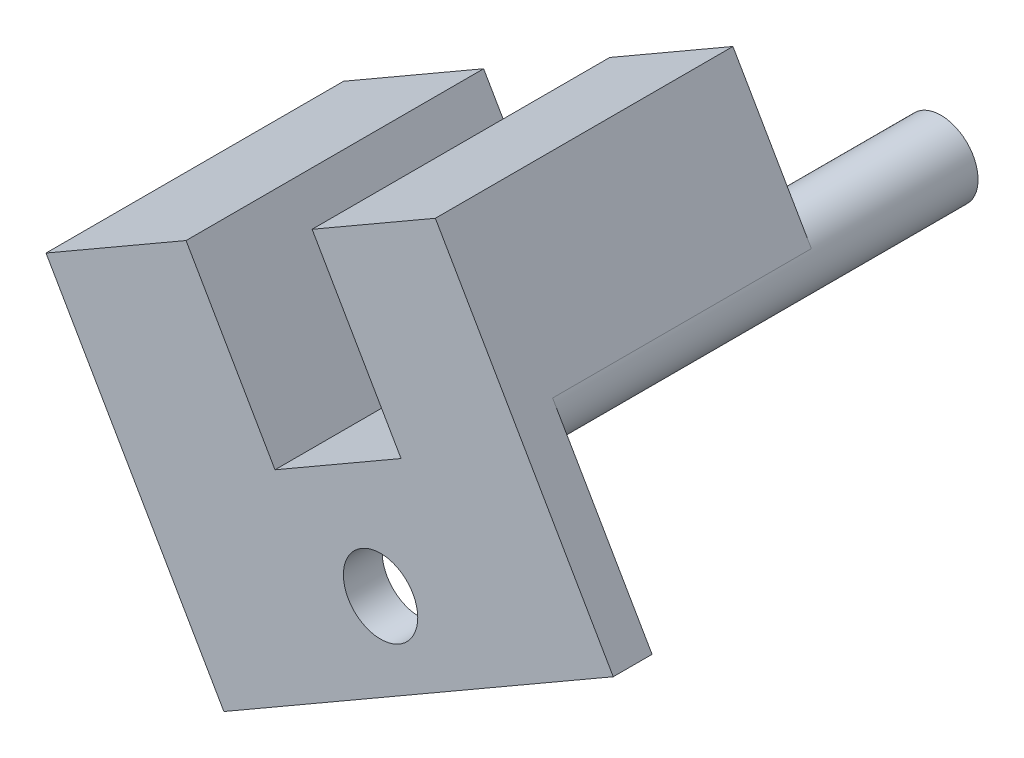
ISO-10303-21;
HEADER;
FILE_DESCRIPTION(('STEP AP214'),'2;1');
FILE_NAME('part.step','',(''),(''),'','','');
FILE_SCHEMA(('AUTOMOTIVE_DESIGN { 1 0 10303 214 1 1 1 1 }'));
ENDSEC;
DATA;
#1=APPLICATION_CONTEXT('core data for automotive mechanical design processes');
#2=APPLICATION_PROTOCOL_DEFINITION('international standard','automotive_design',2000,#1);
#3=PRODUCT_CONTEXT('',#1,'mechanical');
#4=PRODUCT('Part','Part','',(#3));
#5=PRODUCT_RELATED_PRODUCT_CATEGORY('part','',(#4));
#6=PRODUCT_DEFINITION_FORMATION('','',#4);
#7=PRODUCT_DEFINITION_CONTEXT('part definition',#1,'design');
#8=PRODUCT_DEFINITION('design','',#6,#7);
#9=PRODUCT_DEFINITION_SHAPE('','',#8);
#10=(LENGTH_UNIT() NAMED_UNIT(*) SI_UNIT(.MILLI.,.METRE.));
#11=(NAMED_UNIT(*) PLANE_ANGLE_UNIT() SI_UNIT($,.RADIAN.));
#12=(NAMED_UNIT(*) SI_UNIT($,.STERADIAN.) SOLID_ANGLE_UNIT());
#13=UNCERTAINTY_MEASURE_WITH_UNIT(LENGTH_MEASURE(1.E-05),#10,'distance_accuracy_value','');
#14=(GEOMETRIC_REPRESENTATION_CONTEXT(3) GLOBAL_UNCERTAINTY_ASSIGNED_CONTEXT((#13)) GLOBAL_UNIT_ASSIGNED_CONTEXT((#10,
#11,#12)) REPRESENTATION_CONTEXT('',''));
#15=CARTESIAN_POINT('',(0.,0.,0.));
#16=DIRECTION('',(0.,0.,1.));
#17=DIRECTION('',(1.,0.,0.));
#18=AXIS2_PLACEMENT_3D('',#15,#16,#17);
#19=CARTESIAN_POINT('',(-15.3350653225581,-46.6601488963177,8.));
#20=DIRECTION('',(0.,0.,-1.));
#21=DIRECTION('',(-1.,0.,0.));
#22=AXIS2_PLACEMENT_3D('',#19,#20,#21);
#23=CYLINDRICAL_SURFACE('',#22,1.15000000000199);
#24=DIRECTION('',(0.,0.,-1.));
#25=VECTOR('',#24,1.);
#26=CARTESIAN_POINT('',(-16.3309945369119,-47.2351488963187,8.));
#27=LINE('',#26,#25);
#28=CARTESIAN_POINT('',(-16.3309945369119,-47.2351488963187,8.));
#29=VERTEX_POINT('',#28);
#30=CARTESIAN_POINT('',(-16.3309945369119,-47.2351488963187,0.));
#31=VERTEX_POINT('',#30);
#32=EDGE_CURVE('E49',#29,#31,#27,.T.);
#33=ORIENTED_EDGE('',*,*,#32,.T.);
#34=CARTESIAN_POINT('',(-15.3350653225581,-46.6601488963177,0.));
#35=DIRECTION('',(0.,0.,1.));
#36=DIRECTION('',(1.,0.,0.));
#37=AXIS2_PLACEMENT_3D('',#34,#35,#36);
#38=CIRCLE('',#37,1.15000000000199);
#39=CARTESIAN_POINT('',(-14.7600653225571,-47.6560781106716,0.));
#40=VERTEX_POINT('',#39);
#41=EDGE_CURVE('E11',#40,#31,#38,.T.);
#42=ORIENTED_EDGE('',*,*,#41,.F.);
#43=DIRECTION('',(0.,0.,-1.));
#44=VECTOR('',#43,1.);
#45=CARTESIAN_POINT('',(-14.7600653225571,-47.6560781106716,8.));
#46=LINE('',#45,#44);
#47=CARTESIAN_POINT('',(-14.7600653225571,-47.6560781106716,8.));
#48=VERTEX_POINT('',#47);
#49=EDGE_CURVE('E126',#48,#40,#46,.T.);
#50=ORIENTED_EDGE('',*,*,#49,.F.);
#51=CARTESIAN_POINT('',(-15.3350653225581,-46.6601488963177,8.));
#52=DIRECTION('',(0.,0.,1.));
#53=DIRECTION('',(1.,0.,0.));
#54=AXIS2_PLACEMENT_3D('',#51,#52,#53);
#55=CIRCLE('',#54,1.15000000000199);
#56=EDGE_CURVE('E203',#29,#48,#55,.T.);
#57=ORIENTED_EDGE('',*,*,#56,.F.);
#58=EDGE_LOOP('',(#33,#42,#50,#57));
#59=FACE_BOUND('',#58,.T.);
#60=CARTESIAN_POINT('',(-15.3350653225581,-46.6601488963177,-5.));
#61=DIRECTION('',(0.,0.,-1.));
#62=DIRECTION('',(-1.,0.,0.));
#63=AXIS2_PLACEMENT_3D('',#60,#61,#62);
#64=CIRCLE('',#63,1.15000000000199);
#65=CARTESIAN_POINT('',(-16.4850653225601,-46.6601488963177,-5.));
#66=VERTEX_POINT('',#65);
#67=EDGE_CURVE('E271',#66,#66,#64,.F.);
#68=ORIENTED_EDGE('',*,*,#67,.T.);
#69=EDGE_LOOP('',(#68));
#70=FACE_BOUND('',#69,.T.);
#71=ADVANCED_FACE('F35',(#59,#70),#23,.T.);
#72=CARTESIAN_POINT('',(-14.7600653225571,-47.6560781106716,8.));
#73=DIRECTION('',(-0.500000000000001,0.866025403784438,0.));
#74=DIRECTION('',(-0.866025403784438,-0.500000000000001,0.));
#75=AXIS2_PLACEMENT_3D('',#72,#73,#74);
#76=PLANE('',#75);
#77=DIRECTION('',(0.866025403784438,0.500000000000001,0.));
#78=VECTOR('',#77,1.);
#79=CARTESIAN_POINT('',(-14.7600653225571,-47.6560781106716,0.));
#80=LINE('',#79,#78);
#81=CARTESIAN_POINT('',(-4.71417063865764,-41.8560781106715,0.));
#82=VERTEX_POINT('',#81);
#83=EDGE_CURVE('E130',#40,#82,#80,.T.);
#84=ORIENTED_EDGE('',*,*,#83,.T.);
#85=DIRECTION('',(0.,0.,-1.));
#86=VECTOR('',#85,1.);
#87=CARTESIAN_POINT('',(-4.71417063865764,-41.8560781106715,8.));
#88=LINE('',#87,#86);
#89=CARTESIAN_POINT('',(-4.71417063865764,-41.8560781106715,8.));
#90=VERTEX_POINT('',#89);
#91=EDGE_CURVE('E57',#90,#82,#88,.T.);
#92=ORIENTED_EDGE('',*,*,#91,.F.);
#93=DIRECTION('',(0.866025403784438,0.500000000000001,0.));
#94=VECTOR('',#93,1.);
#95=CARTESIAN_POINT('',(-14.7600653225571,-47.6560781106716,8.));
#96=LINE('',#95,#94);
#97=EDGE_CURVE('E138',#48,#90,#96,.T.);
#98=ORIENTED_EDGE('',*,*,#97,.F.);
#99=ORIENTED_EDGE('',*,*,#49,.T.);
#100=EDGE_LOOP('',(#84,#92,#98,#99));
#101=FACE_BOUND('',#100,.T.);
#102=ADVANCED_FACE('F136',(#101),#76,.F.);
#103=CARTESIAN_POINT('',(-5.28917063865863,-40.8601488963177,8.));
#104=DIRECTION('',(0.,0.,-1.));
#105=DIRECTION('',(-1.,0.,0.));
#106=AXIS2_PLACEMENT_3D('',#103,#104,#105);
#107=CYLINDRICAL_SURFACE('',#106,1.15000000000199);
#108=ORIENTED_EDGE('',*,*,#91,.T.);
#109=CARTESIAN_POINT('',(-5.28917063865863,-40.8601488963177,0.));
#110=DIRECTION('',(0.,0.,-1.));
#111=DIRECTION('',(-1.,0.,0.));
#112=AXIS2_PLACEMENT_3D('',#109,#110,#111);
#113=CIRCLE('',#112,1.15000000000199);
#114=CARTESIAN_POINT('',(-4.29324142430481,-40.2851488963167,0.));
#115=VERTEX_POINT('',#114);
#116=EDGE_CURVE('E42',#115,#82,#113,.F.);
#117=ORIENTED_EDGE('',*,*,#116,.F.);
#118=DIRECTION('',(0.,0.,-1.));
#119=VECTOR('',#118,1.);
#120=CARTESIAN_POINT('',(-4.29324142430481,-40.2851488963167,8.));
#121=LINE('',#120,#119);
#122=CARTESIAN_POINT('',(-4.2932414243048,-40.2851488963167,8.));
#123=VERTEX_POINT('',#122);
#124=EDGE_CURVE('E141',#123,#115,#121,.T.);
#125=ORIENTED_EDGE('',*,*,#124,.F.);
#126=CARTESIAN_POINT('',(-5.28917063865863,-40.8601488963177,8.));
#127=DIRECTION('',(0.,0.,1.));
#128=DIRECTION('',(1.,0.,0.));
#129=AXIS2_PLACEMENT_3D('',#126,#127,#128);
#130=CIRCLE('',#129,1.15000000000199);
#131=EDGE_CURVE('E151',#90,#123,#130,.T.);
#132=ORIENTED_EDGE('',*,*,#131,.F.);
#133=EDGE_LOOP('',(#108,#117,#125,#132));
#134=FACE_BOUND('',#133,.T.);
#135=CARTESIAN_POINT('',(-5.28917063865863,-40.8601488963177,-5.));
#136=DIRECTION('',(0.,0.,-1.));
#137=DIRECTION('',(-1.,0.,0.));
#138=AXIS2_PLACEMENT_3D('',#135,#136,#137);
#139=CIRCLE('',#138,1.15000000000199);
#140=CARTESIAN_POINT('',(-6.43917063866061,-40.8601488963177,-5.));
#141=VERTEX_POINT('',#140);
#142=EDGE_CURVE('E265',#141,#141,#139,.F.);
#143=ORIENTED_EDGE('',*,*,#142,.T.);
#144=EDGE_LOOP('',(#143));
#145=FACE_BOUND('',#144,.T.);
#146=ADVANCED_FACE('F289',(#134,#145),#107,.T.);
#147=CARTESIAN_POINT('',(-4.2932414243048,-40.2851488963167,8.));
#148=DIRECTION('',(-0.866025403784438,-0.500000000000001,0.));
#149=DIRECTION('',(0.500000000000001,-0.866025403784438,0.));
#150=AXIS2_PLACEMENT_3D('',#147,#148,#149);
#151=PLANE('',#150);
#152=DIRECTION('',(-0.500000000000001,0.866025403784438,0.));
#153=VECTOR('',#152,1.);
#154=CARTESIAN_POINT('',(-4.2932414243048,-40.2851488963167,0.));
#155=LINE('',#154,#153);
#156=CARTESIAN_POINT('',(-6.71824142430381,-36.0849256879639,0.));
#157=VERTEX_POINT('',#156);
#158=EDGE_CURVE('E133',#115,#157,#155,.T.);
#159=ORIENTED_EDGE('',*,*,#158,.T.);
#160=DIRECTION('',(0.,0.,-1.));
#161=VECTOR('',#160,1.);
#162=CARTESIAN_POINT('',(-6.71824142430381,-36.0849256879639,8.));
#163=LINE('',#162,#161);
#164=CARTESIAN_POINT('',(-6.71824142430381,-36.0849256879639,9.2));
#165=VERTEX_POINT('',#164);
#166=EDGE_CURVE('E145',#165,#157,#163,.T.);
#167=ORIENTED_EDGE('',*,*,#166,.F.);
#168=DIRECTION('',(-0.5,0.866025403784439,0.));
#169=VECTOR('',#168,1.);
#170=CARTESIAN_POINT('',(-1.21824142430381,-45.6112051295928,9.2));
#171=LINE('',#170,#169);
#172=CARTESIAN_POINT('',(-1.21824142430381,-45.6112051295928,9.2));
#173=VERTEX_POINT('',#172);
#174=EDGE_CURVE('E241',#173,#165,#171,.T.);
#175=ORIENTED_EDGE('',*,*,#174,.F.);
#176=DIRECTION('',(0.,0.,-1.));
#177=VECTOR('',#176,1.);
#178=CARTESIAN_POINT('',(-1.21824142430381,-45.6112051295928,9.2));
#179=LINE('',#178,#177);
#180=CARTESIAN_POINT('',(-1.21824142430381,-45.6112051295928,8.));
#181=VERTEX_POINT('',#180);
#182=EDGE_CURVE('E226',#173,#181,#179,.T.);
#183=ORIENTED_EDGE('',*,*,#182,.T.);
#184=DIRECTION('',(-0.5,0.866025403784439,0.));
#185=VECTOR('',#184,1.);
#186=CARTESIAN_POINT('',(-4.29324142430481,-40.2851488963167,8.));
#187=LINE('',#186,#185);
#188=EDGE_CURVE('E220',#181,#123,#187,.T.);
#189=ORIENTED_EDGE('',*,*,#188,.T.);
#190=ORIENTED_EDGE('',*,*,#124,.T.);
#191=EDGE_LOOP('',(#159,#167,#175,#183,#189,#190));
#192=FACE_BOUND('',#191,.T.);
#193=ADVANCED_FACE('F224',(#192),#151,.F.);
#194=CARTESIAN_POINT('',(-6.71824142430381,-36.0849256879639,8.));
#195=DIRECTION('',(0.500000000000001,-0.866025403784438,0.));
#196=DIRECTION('',(0.866025403784438,0.500000000000001,0.));
#197=AXIS2_PLACEMENT_3D('',#194,#195,#196);
#198=PLANE('',#197);
#199=DIRECTION('',(-0.866025403784438,-0.500000000000001,0.));
#200=VECTOR('',#199,1.);
#201=CARTESIAN_POINT('',(-6.71824142430381,-36.0849256879639,0.));
#202=LINE('',#201,#200);
#203=CARTESIAN_POINT('',(-10.5287532009588,-38.2849256879659,0.));
#204=VERTEX_POINT('',#203);
#205=EDGE_CURVE('E181',#157,#204,#202,.T.);
#206=ORIENTED_EDGE('',*,*,#205,.T.);
#207=DIRECTION('',(0.,0.,-1.));
#208=VECTOR('',#207,1.);
#209=CARTESIAN_POINT('',(-10.5287532009588,-38.2849256879659,8.));
#210=LINE('',#209,#208);
#211=CARTESIAN_POINT('',(-10.5287532009588,-38.2849256879659,9.2));
#212=VERTEX_POINT('',#211);
#213=EDGE_CURVE('E171',#212,#204,#210,.T.);
#214=ORIENTED_EDGE('',*,*,#213,.F.);
#215=DIRECTION('',(-0.866025403784438,-0.500000000000001,0.));
#216=VECTOR('',#215,1.);
#217=CARTESIAN_POINT('',(-6.71824142430381,-36.0849256879639,9.2));
#218=LINE('',#217,#216);
#219=EDGE_CURVE('E183',#165,#212,#218,.T.);
#220=ORIENTED_EDGE('',*,*,#219,.F.);
#221=ORIENTED_EDGE('',*,*,#166,.T.);
#222=EDGE_LOOP('',(#206,#214,#220,#221));
#223=FACE_BOUND('',#222,.T.);
#224=ADVANCED_FACE('F180',(#223),#198,.F.);
#225=CARTESIAN_POINT('',(-10.5287532009588,-38.2849256879659,8.));
#226=DIRECTION('',(0.866025403784439,0.5,0.));
#227=DIRECTION('',(-0.5,0.866025403784439,0.));
#228=AXIS2_PLACEMENT_3D('',#225,#226,#227);
#229=PLANE('',#228);
#230=DIRECTION('',(0.5,-0.866025403784439,0.));
#231=VECTOR('',#230,1.);
#232=CARTESIAN_POINT('',(-10.5287532009588,-38.2849256879659,0.));
#233=LINE('',#232,#231);
#234=CARTESIAN_POINT('',(-7.77875320095878,-43.0480654087803,0.));
#235=VERTEX_POINT('',#234);
#236=EDGE_CURVE('E188',#204,#235,#233,.T.);
#237=ORIENTED_EDGE('',*,*,#236,.T.);
#238=DIRECTION('',(0.,0.,-1.));
#239=VECTOR('',#238,1.);
#240=CARTESIAN_POINT('',(-7.77875320095878,-43.0480654087803,8.));
#241=LINE('',#240,#239);
#242=CARTESIAN_POINT('',(-7.77875320095878,-43.0480654087803,9.2));
#243=VERTEX_POINT('',#242);
#244=EDGE_CURVE('E169',#243,#235,#241,.T.);
#245=ORIENTED_EDGE('',*,*,#244,.F.);
#246=DIRECTION('',(0.5,-0.866025403784439,0.));
#247=VECTOR('',#246,1.);
#248=CARTESIAN_POINT('',(-10.5287532009588,-38.2849256879659,9.2));
#249=LINE('',#248,#247);
#250=EDGE_CURVE('E244',#212,#243,#249,.T.);
#251=ORIENTED_EDGE('',*,*,#250,.F.);
#252=ORIENTED_EDGE('',*,*,#213,.T.);
#253=EDGE_LOOP('',(#237,#245,#251,#252));
#254=FACE_BOUND('',#253,.T.);
#255=ADVANCED_FACE('F299',(#254),#229,.F.);
#256=CARTESIAN_POINT('',(-7.77875320095878,-43.0480654087803,8.));
#257=DIRECTION('',(0.5,-0.866025403784439,0.));
#258=DIRECTION('',(0.866025403784439,0.5,0.));
#259=AXIS2_PLACEMENT_3D('',#256,#257,#258);
#260=PLANE('',#259);
#261=DIRECTION('',(-0.866025403784439,-0.5,0.));
#262=VECTOR('',#261,1.);
#263=CARTESIAN_POINT('',(-7.77875320095878,-43.0480654087803,0.));
#264=LINE('',#263,#262);
#265=CARTESIAN_POINT('',(-11.6758675179888,-45.2980654087803,0.));
#266=VERTEX_POINT('',#265);
#267=EDGE_CURVE('E190',#235,#266,#264,.T.);
#268=ORIENTED_EDGE('',*,*,#267,.T.);
#269=DIRECTION('',(0.,0.,-1.));
#270=VECTOR('',#269,1.);
#271=CARTESIAN_POINT('',(-11.6758675179888,-45.2980654087803,8.));
#272=LINE('',#271,#270);
#273=CARTESIAN_POINT('',(-11.6758675179888,-45.2980654087803,9.2));
#274=VERTEX_POINT('',#273);
#275=EDGE_CURVE('E166',#274,#266,#272,.T.);
#276=ORIENTED_EDGE('',*,*,#275,.F.);
#277=DIRECTION('',(-0.866025403784439,-0.5,0.));
#278=VECTOR('',#277,1.);
#279=CARTESIAN_POINT('',(-7.77875320095878,-43.0480654087803,9.2));
#280=LINE('',#279,#278);
#281=EDGE_CURVE('E247',#243,#274,#280,.T.);
#282=ORIENTED_EDGE('',*,*,#281,.F.);
#283=ORIENTED_EDGE('',*,*,#244,.T.);
#284=EDGE_LOOP('',(#268,#276,#282,#283));
#285=FACE_BOUND('',#284,.T.);
#286=ADVANCED_FACE('F302',(#285),#260,.F.);
#287=CARTESIAN_POINT('',(-11.6758675179888,-45.2980654087803,8.));
#288=DIRECTION('',(-0.866025403784439,-0.499999999999999,0.));
#289=DIRECTION('',(0.499999999999999,-0.866025403784439,0.));
#290=AXIS2_PLACEMENT_3D('',#287,#288,#289);
#291=PLANE('',#290);
#292=DIRECTION('',(-0.5,0.866025403784439,0.));
#293=VECTOR('',#292,1.);
#294=CARTESIAN_POINT('',(-11.6758675179888,-45.2980654087803,0.));
#295=LINE('',#294,#293);
#296=CARTESIAN_POINT('',(-14.4258675179888,-40.5349256879659,0.));
#297=VERTEX_POINT('',#296);
#298=EDGE_CURVE('E199',#266,#297,#295,.T.);
#299=ORIENTED_EDGE('',*,*,#298,.T.);
#300=DIRECTION('',(0.,0.,-1.));
#301=VECTOR('',#300,1.);
#302=CARTESIAN_POINT('',(-14.4258675179888,-40.5349256879659,8.));
#303=LINE('',#302,#301);
#304=CARTESIAN_POINT('',(-14.4258675179888,-40.5349256879659,9.2));
#305=VERTEX_POINT('',#304);
#306=EDGE_CURVE('E163',#305,#297,#303,.T.);
#307=ORIENTED_EDGE('',*,*,#306,.F.);
#308=DIRECTION('',(-0.5,0.866025403784439,0.));
#309=VECTOR('',#308,1.);
#310=CARTESIAN_POINT('',(-11.6758675179888,-45.2980654087803,9.2));
#311=LINE('',#310,#309);
#312=EDGE_CURVE('E250',#274,#305,#311,.T.);
#313=ORIENTED_EDGE('',*,*,#312,.F.);
#314=ORIENTED_EDGE('',*,*,#275,.T.);
#315=EDGE_LOOP('',(#299,#307,#313,#314));
#316=FACE_BOUND('',#315,.T.);
#317=ADVANCED_FACE('F305',(#316),#291,.F.);
#318=CARTESIAN_POINT('',(-14.4258675179888,-40.5349256879659,8.));
#319=DIRECTION('',(0.500000000000001,-0.866025403784438,0.));
#320=DIRECTION('',(0.866025403784438,0.500000000000001,0.));
#321=AXIS2_PLACEMENT_3D('',#318,#319,#320);
#322=PLANE('',#321);
#323=DIRECTION('',(-0.866025403784438,-0.5,0.));
#324=VECTOR('',#323,1.);
#325=CARTESIAN_POINT('',(-14.4258675179888,-40.5349256879659,0.));
#326=LINE('',#325,#324);
#327=CARTESIAN_POINT('',(-18.7559945369109,-43.0349256879659,0.));
#328=VERTEX_POINT('',#327);
#329=EDGE_CURVE('E201',#297,#328,#326,.T.);
#330=ORIENTED_EDGE('',*,*,#329,.T.);
#331=DIRECTION('',(0.,0.,-1.));
#332=VECTOR('',#331,1.);
#333=CARTESIAN_POINT('',(-18.7559945369109,-43.0349256879659,8.));
#334=LINE('',#333,#332);
#335=CARTESIAN_POINT('',(-18.7559945369109,-43.0349256879659,9.2));
#336=VERTEX_POINT('',#335);
#337=EDGE_CURVE('E160',#336,#328,#334,.T.);
#338=ORIENTED_EDGE('',*,*,#337,.F.);
#339=DIRECTION('',(-0.866025403784438,-0.5,0.));
#340=VECTOR('',#339,1.);
#341=CARTESIAN_POINT('',(-14.4258675179888,-40.5349256879659,9.2));
#342=LINE('',#341,#340);
#343=EDGE_CURVE('E227',#305,#336,#342,.T.);
#344=ORIENTED_EDGE('',*,*,#343,.F.);
#345=ORIENTED_EDGE('',*,*,#306,.T.);
#346=EDGE_LOOP('',(#330,#338,#344,#345));
#347=FACE_BOUND('',#346,.T.);
#348=ADVANCED_FACE('F309',(#347),#322,.F.);
#349=CARTESIAN_POINT('',(-18.7559945369109,-43.0349256879659,8.));
#350=DIRECTION('',(0.866025403784438,0.500000000000001,0.));
#351=DIRECTION('',(-0.500000000000001,0.866025403784438,0.));
#352=AXIS2_PLACEMENT_3D('',#349,#350,#351);
#353=PLANE('',#352);
#354=DIRECTION('',(0.500000000000001,-0.866025403784438,0.));
#355=VECTOR('',#354,1.);
#356=CARTESIAN_POINT('',(-18.7559945369109,-43.0349256879659,0.));
#357=LINE('',#356,#355);
#358=EDGE_CURVE('E202',#328,#31,#357,.T.);
#359=ORIENTED_EDGE('',*,*,#358,.T.);
#360=ORIENTED_EDGE('',*,*,#32,.F.);
#361=DIRECTION('',(0.5,-0.866025403784439,0.));
#362=VECTOR('',#361,1.);
#363=CARTESIAN_POINT('',(-16.3309945369119,-47.2351488963187,8.));
#364=LINE('',#363,#362);
#365=CARTESIAN_POINT('',(-13.2559945369109,-52.5612051295948,8.));
#366=VERTEX_POINT('',#365);
#367=EDGE_CURVE('E194',#29,#366,#364,.T.);
#368=ORIENTED_EDGE('',*,*,#367,.T.);
#369=DIRECTION('',(0.,0.,-1.));
#370=VECTOR('',#369,1.);
#371=CARTESIAN_POINT('',(-13.2559945369109,-52.5612051295948,9.2));
#372=LINE('',#371,#370);
#373=CARTESIAN_POINT('',(-13.2559945369109,-52.5612051295948,9.2));
#374=VERTEX_POINT('',#373);
#375=EDGE_CURVE('E134',#374,#366,#372,.T.);
#376=ORIENTED_EDGE('',*,*,#375,.F.);
#377=DIRECTION('',(0.500000000000001,-0.866025403784438,0.));
#378=VECTOR('',#377,1.);
#379=CARTESIAN_POINT('',(-18.7559945369109,-43.0349256879659,9.2));
#380=LINE('',#379,#378);
#381=EDGE_CURVE('E230',#336,#374,#380,.T.);
#382=ORIENTED_EDGE('',*,*,#381,.F.);
#383=ORIENTED_EDGE('',*,*,#337,.T.);
#384=EDGE_LOOP('',(#359,#360,#368,#376,#382,#383));
#385=FACE_BOUND('',#384,.T.);
#386=ADVANCED_FACE('F313',(#385),#353,.F.);
#387=CARTESIAN_POINT('',(-15.3350653225581,-46.6601488963177,0.));
#388=DIRECTION('',(0.,0.,1.));
#389=DIRECTION('',(1.,0.,0.));
#390=AXIS2_PLACEMENT_3D('',#387,#388,#389);
#391=PLANE('',#390);
#392=ORIENTED_EDGE('',*,*,#83,.F.);
#393=ORIENTED_EDGE('',*,*,#41,.T.);
#394=ORIENTED_EDGE('',*,*,#358,.F.);
#395=ORIENTED_EDGE('',*,*,#329,.F.);
#396=ORIENTED_EDGE('',*,*,#298,.F.);
#397=ORIENTED_EDGE('',*,*,#267,.F.);
#398=ORIENTED_EDGE('',*,*,#236,.F.);
#399=ORIENTED_EDGE('',*,*,#205,.F.);
#400=ORIENTED_EDGE('',*,*,#158,.F.);
#401=ORIENTED_EDGE('',*,*,#116,.T.);
#402=EDGE_LOOP('',(#392,#393,#394,#395,#396,#397,#398,#399,#400,#401));
#403=FACE_BOUND('',#402,.T.);
#404=ADVANCED_FACE('F131',(#403),#391,.F.);
#405=CARTESIAN_POINT('',(-18.7559945369109,-43.0349256879659,8.));
#406=DIRECTION('',(0.,0.,1.));
#407=DIRECTION('',(1.,0.,0.));
#408=AXIS2_PLACEMENT_3D('',#405,#406,#407);
#409=PLANE('',#408);
#410=CARTESIAN_POINT('',(-8.41211798060837,-47.0510454306986,8.));
#411=DIRECTION('',(0.,0.,1.));
#412=DIRECTION('',(1.,0.,0.));
#413=AXIS2_PLACEMENT_3D('',#410,#411,#412);
#414=CIRCLE('',#413,1.15000000000199);
#415=CARTESIAN_POINT('',(-7.26211798060638,-47.0510454306986,8.));
#416=VERTEX_POINT('',#415);
#417=EDGE_CURVE('E260',#416,#416,#414,.T.);
#418=ORIENTED_EDGE('',*,*,#417,.T.);
#419=EDGE_LOOP('',(#418));
#420=FACE_BOUND('',#419,.T.);
#421=ORIENTED_EDGE('',*,*,#367,.F.);
#422=ORIENTED_EDGE('',*,*,#56,.T.);
#423=ORIENTED_EDGE('',*,*,#97,.T.);
#424=ORIENTED_EDGE('',*,*,#131,.T.);
#425=ORIENTED_EDGE('',*,*,#188,.F.);
#426=DIRECTION('',(0.866025403784438,0.500000000000001,0.));
#427=VECTOR('',#426,1.);
#428=CARTESIAN_POINT('',(-13.2559945369109,-52.5612051295948,8.));
#429=LINE('',#428,#427);
#430=EDGE_CURVE('E228',#366,#181,#429,.T.);
#431=ORIENTED_EDGE('',*,*,#430,.F.);
#432=EDGE_LOOP('',(#421,#422,#423,#424,#425,#431));
#433=FACE_BOUND('',#432,.T.);
#434=ADVANCED_FACE('F217',(#420,#433),#409,.F.);
#435=CARTESIAN_POINT('',(-18.7559945369109,-43.0349256879659,9.2));
#436=DIRECTION('',(0.,0.,1.));
#437=DIRECTION('',(1.,0.,0.));
#438=AXIS2_PLACEMENT_3D('',#435,#436,#437);
#439=PLANE('',#438);
#440=ORIENTED_EDGE('',*,*,#343,.T.);
#441=ORIENTED_EDGE('',*,*,#381,.T.);
#442=DIRECTION('',(0.866025403784438,0.500000000000001,0.));
#443=VECTOR('',#442,1.);
#444=CARTESIAN_POINT('',(-13.2559945369109,-52.5612051295948,9.2));
#445=LINE('',#444,#443);
#446=EDGE_CURVE('E239',#374,#173,#445,.T.);
#447=ORIENTED_EDGE('',*,*,#446,.T.);
#448=ORIENTED_EDGE('',*,*,#174,.T.);
#449=ORIENTED_EDGE('',*,*,#219,.T.);
#450=ORIENTED_EDGE('',*,*,#250,.T.);
#451=ORIENTED_EDGE('',*,*,#281,.T.);
#452=ORIENTED_EDGE('',*,*,#312,.T.);
#453=EDGE_LOOP('',(#440,#441,#447,#448,#449,#450,#451,#452));
#454=FACE_BOUND('',#453,.T.);
#455=CARTESIAN_POINT('',(-8.41211798060837,-47.0510454306986,9.2));
#456=DIRECTION('',(0.,0.,1.));
#457=DIRECTION('',(1.,0.,0.));
#458=AXIS2_PLACEMENT_3D('',#455,#456,#457);
#459=CIRCLE('',#458,1.15000000000199);
#460=CARTESIAN_POINT('',(-7.26211798060638,-47.0510454306986,9.2));
#461=VERTEX_POINT('',#460);
#462=EDGE_CURVE('E258',#461,#461,#459,.T.);
#463=ORIENTED_EDGE('',*,*,#462,.F.);
#464=EDGE_LOOP('',(#463));
#465=FACE_BOUND('',#464,.T.);
#466=ADVANCED_FACE('F321',(#454,#465),#439,.T.);
#467=CARTESIAN_POINT('',(-13.2559945369109,-52.5612051295948,9.2));
#468=DIRECTION('',(-0.500000000000001,0.866025403784438,0.));
#469=DIRECTION('',(-0.866025403784438,-0.500000000000001,0.));
#470=AXIS2_PLACEMENT_3D('',#467,#468,#469);
#471=PLANE('',#470);
#472=ORIENTED_EDGE('',*,*,#430,.T.);
#473=ORIENTED_EDGE('',*,*,#182,.F.);
#474=ORIENTED_EDGE('',*,*,#446,.F.);
#475=ORIENTED_EDGE('',*,*,#375,.T.);
#476=EDGE_LOOP('',(#472,#473,#474,#475));
#477=FACE_BOUND('',#476,.T.);
#478=ADVANCED_FACE('F256',(#477),#471,.F.);
#479=CARTESIAN_POINT('',(-8.41211798060837,-47.0510454306986,9.2));
#480=DIRECTION('',(0.,0.,-1.));
#481=DIRECTION('',(-1.,0.,0.));
#482=AXIS2_PLACEMENT_3D('',#479,#480,#481);
#483=CYLINDRICAL_SURFACE('',#482,1.15000000000199);
#484=ORIENTED_EDGE('',*,*,#462,.T.);
#485=EDGE_LOOP('',(#484));
#486=FACE_BOUND('',#485,.T.);
#487=ORIENTED_EDGE('',*,*,#417,.F.);
#488=EDGE_LOOP('',(#487));
#489=FACE_BOUND('',#488,.T.);
#490=ADVANCED_FACE('F282',(#486,#489),#483,.F.);
#491=CARTESIAN_POINT('',(-25.9808853901276,-42.9854887755084,-5.));
#492=DIRECTION('',(0.,0.,-1.));
#493=DIRECTION('',(-1.,0.,0.));
#494=AXIS2_PLACEMENT_3D('',#491,#492,#493);
#495=PLANE('',#494);
#496=ORIENTED_EDGE('',*,*,#142,.F.);
#497=EDGE_LOOP('',(#496));
#498=FACE_BOUND('',#497,.T.);
#499=ADVANCED_FACE('F277',(#498),#495,.T.);
#500=CARTESIAN_POINT('',(-25.9808853901276,-42.9854887755084,-5.));
#501=DIRECTION('',(0.,0.,-1.));
#502=DIRECTION('',(-1.,0.,0.));
#503=AXIS2_PLACEMENT_3D('',#500,#501,#502);
#504=PLANE('',#503);
#505=ORIENTED_EDGE('',*,*,#67,.F.);
#506=EDGE_LOOP('',(#505));
#507=FACE_BOUND('',#506,.T.);
#508=ADVANCED_FACE('F275',(#507),#504,.T.);
#509=CLOSED_SHELL('',(#71,#102,#146,#193,#224,#255,#286,#317,#348,#386,#404,#434,#466,#478,#490,
#499,#508));
#510=MANIFOLD_SOLID_BREP('B2',#509);
#511=ADVANCED_BREP_SHAPE_REPRESENTATION('',(#18,#510),#14);
#512=SHAPE_DEFINITION_REPRESENTATION(#9,#511);
ENDSEC;
END-ISO-10303-21;
